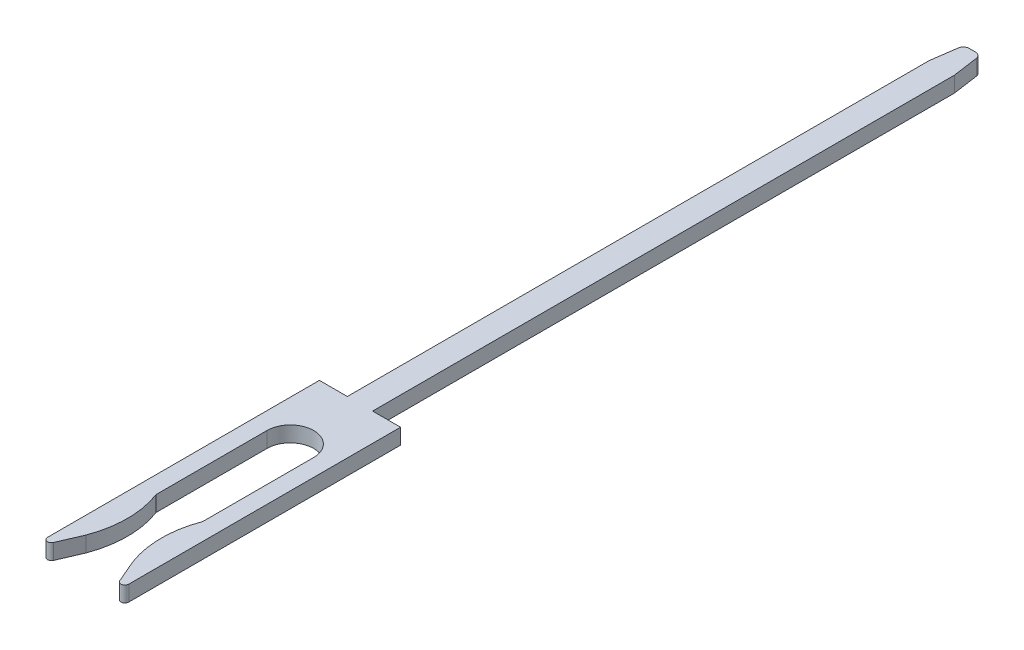
ISO-10303-21;
HEADER;
FILE_DESCRIPTION(('STEP AP214'),'2;1');
FILE_NAME('part.step','',(''),(''),'','','');
FILE_SCHEMA(('AUTOMOTIVE_DESIGN { 1 0 10303 214 1 1 1 1 }'));
ENDSEC;
DATA;
#1=APPLICATION_CONTEXT('core data for automotive mechanical design processes');
#2=APPLICATION_PROTOCOL_DEFINITION('international standard','automotive_design',2000,#1);
#3=PRODUCT_CONTEXT('',#1,'mechanical');
#4=PRODUCT('Part','Part','',(#3));
#5=PRODUCT_RELATED_PRODUCT_CATEGORY('part','',(#4));
#6=PRODUCT_DEFINITION_FORMATION('','',#4);
#7=PRODUCT_DEFINITION_CONTEXT('part definition',#1,'design');
#8=PRODUCT_DEFINITION('design','',#6,#7);
#9=PRODUCT_DEFINITION_SHAPE('','',#8);
#10=(LENGTH_UNIT() NAMED_UNIT(*) SI_UNIT(.MILLI.,.METRE.));
#11=(NAMED_UNIT(*) PLANE_ANGLE_UNIT() SI_UNIT($,.RADIAN.));
#12=(NAMED_UNIT(*) SI_UNIT($,.STERADIAN.) SOLID_ANGLE_UNIT());
#13=UNCERTAINTY_MEASURE_WITH_UNIT(LENGTH_MEASURE(1.E-05),#10,'distance_accuracy_value','');
#14=(GEOMETRIC_REPRESENTATION_CONTEXT(3) GLOBAL_UNCERTAINTY_ASSIGNED_CONTEXT((#13)) GLOBAL_UNIT_ASSIGNED_CONTEXT((#10,
#11,#12)) REPRESENTATION_CONTEXT('',''));
#15=CARTESIAN_POINT('',(0.,0.,0.));
#16=DIRECTION('',(0.,0.,1.));
#17=DIRECTION('',(1.,0.,0.));
#18=AXIS2_PLACEMENT_3D('',#15,#16,#17);
#19=CARTESIAN_POINT('',(0.,-0.2,-1.608293682814));
#20=DIRECTION('',(0.,1.,0.));
#21=DIRECTION('',(-1.,0.,0.));
#22=AXIS2_PLACEMENT_3D('',#19,#20,#21);
#23=PLANE('',#22);
#24=CARTESIAN_POINT('',(0.942803458142,-0.2,7.87327103256));
#25=DIRECTION('',(0.,1.,0.));
#26=DIRECTION('',(0.,0.,1.));
#27=AXIS2_PLACEMENT_3D('',#24,#25,#26);
#28=CIRCLE('',#27,0.1);
#29=CARTESIAN_POINT('',(0.850958820007882,-0.2,7.91282558281616));
#30=VERTEX_POINT('',#29);
#31=CARTESIAN_POINT('',(1.042803458142,-0.2,7.87327103256));
#32=VERTEX_POINT('',#31);
#33=EDGE_CURVE('E20',#30,#32,#28,.T.);
#34=ORIENTED_EDGE('',*,*,#33,.F.);
#35=DIRECTION('',(0.395545502563452,0.,0.918446381342877));
#36=VECTOR('',#35,1.);
#37=CARTESIAN_POINT('',(0.600313171744,-0.2,7.330832898901));
#38=LINE('',#37,#36);
#39=CARTESIAN_POINT('',(0.600313171747545,-0.2,7.33083289890927));
#40=VERTEX_POINT('',#39);
#41=EDGE_CURVE('E123',#40,#30,#38,.T.);
#42=ORIENTED_EDGE('',*,*,#41,.F.);
#43=CARTESIAN_POINT('',(2.982794916699,-0.2,6.429959744357));
#44=DIRECTION('',(0.,1.,0.));
#45=DIRECTION('',(0.,0.,1.));
#46=AXIS2_PLACEMENT_3D('',#43,#44,#45);
#47=CIRCLE('',#46,2.547114388012);
#48=CARTESIAN_POINT('',(0.60031317174438,-0.2,5.52908658981429));
#49=VERTEX_POINT('',#48);
#50=EDGE_CURVE('E145',#49,#40,#47,.T.);
#51=ORIENTED_EDGE('',*,*,#50,.F.);
#52=DIRECTION('',(0.,0.,1.));
#53=VECTOR('',#52,1.);
#54=CARTESIAN_POINT('',(0.600313171744,-0.2,4.103376530111));
#55=LINE('',#54,#53);
#56=CARTESIAN_POINT('',(0.600313171744,-0.2,2.677666470408));
#57=VERTEX_POINT('',#56);
#58=EDGE_CURVE('E152',#57,#49,#55,.T.);
#59=ORIENTED_EDGE('',*,*,#58,.F.);
#60=CARTESIAN_POINT('',(0.,-0.2,2.677666470408));
#61=DIRECTION('',(0.,1.,0.));
#62=DIRECTION('',(0.,0.,1.));
#63=AXIS2_PLACEMENT_3D('',#60,#61,#62);
#64=CIRCLE('',#63,0.600313171744);
#65=CARTESIAN_POINT('',(-0.600313171744,-0.2,2.677666470408));
#66=VERTEX_POINT('',#65);
#67=EDGE_CURVE('E158',#57,#66,#64,.T.);
#68=ORIENTED_EDGE('',*,*,#67,.T.);
#69=DIRECTION('',(0.,0.,-1.));
#70=VECTOR('',#69,1.);
#71=CARTESIAN_POINT('',(-0.600313171744,-0.2,4.103376530111));
#72=LINE('',#71,#70);
#73=CARTESIAN_POINT('',(-0.600313171744,-0.2,5.52908658981415));
#74=VERTEX_POINT('',#73);
#75=EDGE_CURVE('E162',#74,#66,#72,.T.);
#76=ORIENTED_EDGE('',*,*,#75,.F.);
#77=CARTESIAN_POINT('',(-2.982794916699,-0.2,6.429959744357));
#78=DIRECTION('',(0.,1.,0.));
#79=DIRECTION('',(0.,0.,1.));
#80=AXIS2_PLACEMENT_3D('',#77,#78,#79);
#81=CIRCLE('',#80,2.547114388012);
#82=CARTESIAN_POINT('',(-0.600313171748136,-0.2,7.33083289890964));
#83=VERTEX_POINT('',#82);
#84=EDGE_CURVE('E163',#83,#74,#81,.T.);
#85=ORIENTED_EDGE('',*,*,#84,.F.);
#86=DIRECTION('',(0.395545502563026,0.,-0.918446381343061));
#87=VECTOR('',#86,1.);
#88=CARTESIAN_POINT('',(-0.725635995876,-0.2,7.621829240859));
#89=LINE('',#88,#87);
#90=CARTESIAN_POINT('',(-0.850958820007715,-0.2,7.91282558281621));
#91=VERTEX_POINT('',#90);
#92=EDGE_CURVE('E167',#91,#83,#89,.T.);
#93=ORIENTED_EDGE('',*,*,#92,.F.);
#94=CARTESIAN_POINT('',(-0.942803458142,-0.2,7.87327103256));
#95=DIRECTION('',(0.,1.,0.));
#96=DIRECTION('',(0.,0.,1.));
#97=AXIS2_PLACEMENT_3D('',#94,#95,#96);
#98=CIRCLE('',#97,0.1);
#99=CARTESIAN_POINT('',(-1.042803458142,-0.2,7.87327103256));
#100=VERTEX_POINT('',#99);
#101=EDGE_CURVE('E171',#100,#91,#98,.T.);
#102=ORIENTED_EDGE('',*,*,#101,.F.);
#103=DIRECTION('',(0.,0.,1.));
#104=VECTOR('',#103,1.);
#105=CARTESIAN_POINT('',(-1.042803458142,-0.2,4.380777440661));
#106=LINE('',#105,#104);
#107=CARTESIAN_POINT('',(-1.042803458142,-0.2,0.888283848763));
#108=VERTEX_POINT('',#107);
#109=EDGE_CURVE('E175',#108,#100,#106,.T.);
#110=ORIENTED_EDGE('',*,*,#109,.F.);
#111=DIRECTION('',(-1.,0.,0.));
#112=VECTOR('',#111,1.);
#113=CARTESIAN_POINT('',(-0.68363654254,-0.2,0.888283848763));
#114=LINE('',#113,#112);
#115=CARTESIAN_POINT('',(-0.324469626938,-0.2,0.888283848763));
#116=VERTEX_POINT('',#115);
#117=EDGE_CURVE('E179',#116,#108,#114,.T.);
#118=ORIENTED_EDGE('',*,*,#117,.F.);
#119=DIRECTION('',(0.,0.,1.));
#120=VECTOR('',#119,1.);
#121=CARTESIAN_POINT('',(-0.324469626938,-0.2,-6.586787692129));
#122=LINE('',#121,#120);
#123=CARTESIAN_POINT('',(-0.324469626937927,-0.2,-14.06185923302));
#124=VERTEX_POINT('',#123);
#125=EDGE_CURVE('E192',#124,#116,#122,.T.);
#126=ORIENTED_EDGE('',*,*,#125,.F.);
#127=DIRECTION('',(-0.14003721977097,0.,0.990146240248791));
#128=VECTOR('',#127,1.);
#129=CARTESIAN_POINT('',(-0.277856708192,-0.2,-14.39144022812));
#130=LINE('',#129,#128);
#131=CARTESIAN_POINT('',(-0.231243789446517,-0.2,-14.7210212232179));
#132=VERTEX_POINT('',#131);
#133=EDGE_CURVE('E203',#132,#124,#130,.T.);
#134=ORIENTED_EDGE('',*,*,#133,.F.);
#135=CARTESIAN_POINT('',(-0.08272185340831,-0.2,-14.70001564025));
#136=DIRECTION('',(0.,1.,0.));
#137=DIRECTION('',(0.,0.,1.));
#138=AXIS2_PLACEMENT_3D('',#135,#136,#137);
#139=CIRCLE('',#138,0.15);
#140=CARTESIAN_POINT('',(-0.08272185340831,-0.2,-14.85001564025));
#141=VERTEX_POINT('',#140);
#142=EDGE_CURVE('E209',#141,#132,#139,.T.);
#143=ORIENTED_EDGE('',*,*,#142,.F.);
#144=DIRECTION('',(-1.,0.,0.));
#145=VECTOR('',#144,1.);
#146=CARTESIAN_POINT('',(0.,-0.2,-14.85001564025));
#147=LINE('',#146,#145);
#148=CARTESIAN_POINT('',(0.08272185340831,-0.2,-14.85001564025));
#149=VERTEX_POINT('',#148);
#150=EDGE_CURVE('E213',#149,#141,#147,.T.);
#151=ORIENTED_EDGE('',*,*,#150,.F.);
#152=CARTESIAN_POINT('',(0.08272185340831,-0.2,-14.70001564025));
#153=DIRECTION('',(0.,1.,0.));
#154=DIRECTION('',(0.,0.,1.));
#155=AXIS2_PLACEMENT_3D('',#152,#153,#154);
#156=CIRCLE('',#155,0.15);
#157=CARTESIAN_POINT('',(0.231243789445924,-0.2,-14.7210212232178));
#158=VERTEX_POINT('',#157);
#159=EDGE_CURVE('E217',#158,#149,#156,.T.);
#160=ORIENTED_EDGE('',*,*,#159,.F.);
#161=DIRECTION('',(-0.14003721977097,0.,-0.990146240248791));
#162=VECTOR('',#161,1.);
#163=CARTESIAN_POINT('',(0.277856708192,-0.2,-14.39144022812));
#164=LINE('',#163,#162);
#165=CARTESIAN_POINT('',(0.324469626937855,-0.2,-14.06185923302));
#166=VERTEX_POINT('',#165);
#167=EDGE_CURVE('E221',#166,#158,#164,.T.);
#168=ORIENTED_EDGE('',*,*,#167,.F.);
#169=DIRECTION('',(0.,0.,-1.));
#170=VECTOR('',#169,1.);
#171=CARTESIAN_POINT('',(0.324469626938,-0.2,-6.586787692129));
#172=LINE('',#171,#170);
#173=CARTESIAN_POINT('',(0.324469626938,-0.2,0.888283848763));
#174=VERTEX_POINT('',#173);
#175=EDGE_CURVE('E225',#174,#166,#172,.T.);
#176=ORIENTED_EDGE('',*,*,#175,.F.);
#177=DIRECTION('',(-1.,0.,0.));
#178=VECTOR('',#177,1.);
#179=CARTESIAN_POINT('',(0.68363654254,-0.2,0.888283848763));
#180=LINE('',#179,#178);
#181=CARTESIAN_POINT('',(1.042803458142,-0.2,0.888283848763));
#182=VERTEX_POINT('',#181);
#183=EDGE_CURVE('E238',#182,#174,#180,.T.);
#184=ORIENTED_EDGE('',*,*,#183,.F.);
#185=DIRECTION('',(0.,0.,-1.));
#186=VECTOR('',#185,1.);
#187=CARTESIAN_POINT('',(1.042803458142,-0.2,4.380777440661));
#188=LINE('',#187,#186);
#189=EDGE_CURVE('E135',#32,#182,#188,.T.);
#190=ORIENTED_EDGE('',*,*,#189,.F.);
#191=EDGE_LOOP('',(#34,#42,#51,#59,#68,#76,#85,#93,#102,#110,#118,#126,#134,#143,#151,#160,#168,
#176,#184,#190));
#192=FACE_BOUND('',#191,.T.);
#193=ADVANCED_FACE('F17',(#192),#23,.F.);
#194=CARTESIAN_POINT('',(0.942803458142,-0.2,7.87327103256));
#195=DIRECTION('',(0.,1.,0.));
#196=DIRECTION('',(0.,0.,1.));
#197=AXIS2_PLACEMENT_3D('',#194,#195,#196);
#198=CYLINDRICAL_SURFACE('',#197,0.1);
#199=ORIENTED_EDGE('',*,*,#33,.T.);
#200=DIRECTION('',(0.,1.,0.));
#201=VECTOR('',#200,1.);
#202=CARTESIAN_POINT('',(1.042803458142,-0.2,7.87327103256));
#203=LINE('',#202,#201);
#204=CARTESIAN_POINT('',(1.042803458142,0.2,7.87327103256));
#205=VERTEX_POINT('',#204);
#206=EDGE_CURVE('E138',#205,#32,#203,.F.);
#207=ORIENTED_EDGE('',*,*,#206,.F.);
#208=CARTESIAN_POINT('',(0.942803458142,0.2,7.87327103256));
#209=DIRECTION('',(0.,1.,0.));
#210=DIRECTION('',(0.,0.,1.));
#211=AXIS2_PLACEMENT_3D('',#208,#209,#210);
#212=CIRCLE('',#211,0.1);
#213=CARTESIAN_POINT('',(0.850958820007882,0.2,7.91282558281616));
#214=VERTEX_POINT('',#213);
#215=EDGE_CURVE('E141',#214,#205,#212,.T.);
#216=ORIENTED_EDGE('',*,*,#215,.F.);
#217=DIRECTION('',(0.,1.,0.));
#218=VECTOR('',#217,1.);
#219=CARTESIAN_POINT('',(0.850958820007684,-0.2,7.91282558281614));
#220=LINE('',#219,#218);
#221=EDGE_CURVE('E127',#30,#214,#220,.T.);
#222=ORIENTED_EDGE('',*,*,#221,.F.);
#223=EDGE_LOOP('',(#199,#207,#216,#222));
#224=FACE_BOUND('',#223,.T.);
#225=ADVANCED_FACE('F139',(#224),#198,.T.);
#226=CARTESIAN_POINT('',(1.042803458142,-0.2,4.380777440661));
#227=DIRECTION('',(1.,0.,0.));
#228=DIRECTION('',(0.,0.,-1.));
#229=AXIS2_PLACEMENT_3D('',#226,#227,#228);
#230=PLANE('',#229);
#231=ORIENTED_EDGE('',*,*,#189,.T.);
#232=DIRECTION('',(0.,1.,0.));
#233=VECTOR('',#232,1.);
#234=CARTESIAN_POINT('',(1.042803458142,-0.2,0.888283848763));
#235=LINE('',#234,#233);
#236=CARTESIAN_POINT('',(1.042803458142,0.2,0.888283848763));
#237=VERTEX_POINT('',#236);
#238=EDGE_CURVE('E245',#237,#182,#235,.F.);
#239=ORIENTED_EDGE('',*,*,#238,.F.);
#240=DIRECTION('',(0.,0.,1.));
#241=VECTOR('',#240,1.);
#242=CARTESIAN_POINT('',(1.042803458142,0.2,-1.608293682814));
#243=LINE('',#242,#241);
#244=EDGE_CURVE('E143',#205,#237,#243,.F.);
#245=ORIENTED_EDGE('',*,*,#244,.F.);
#246=ORIENTED_EDGE('',*,*,#206,.T.);
#247=EDGE_LOOP('',(#231,#239,#245,#246));
#248=FACE_BOUND('',#247,.T.);
#249=ADVANCED_FACE('F343',(#248),#230,.T.);
#250=CARTESIAN_POINT('',(0.68363654254,-0.2,0.888283848763));
#251=DIRECTION('',(0.,0.,-1.));
#252=DIRECTION('',(-1.,0.,0.));
#253=AXIS2_PLACEMENT_3D('',#250,#251,#252);
#254=PLANE('',#253);
#255=ORIENTED_EDGE('',*,*,#183,.T.);
#256=DIRECTION('',(0.,1.,0.));
#257=VECTOR('',#256,1.);
#258=CARTESIAN_POINT('',(0.324469626938,-0.2,0.888283848763));
#259=LINE('',#258,#257);
#260=CARTESIAN_POINT('',(0.324469626938,0.2,0.888283848763));
#261=VERTEX_POINT('',#260);
#262=EDGE_CURVE('E235',#261,#174,#259,.F.);
#263=ORIENTED_EDGE('',*,*,#262,.F.);
#264=DIRECTION('',(-1.,0.,0.));
#265=VECTOR('',#264,1.);
#266=CARTESIAN_POINT('',(0.,0.2,0.888283848763));
#267=LINE('',#266,#265);
#268=EDGE_CURVE('E232',#237,#261,#267,.T.);
#269=ORIENTED_EDGE('',*,*,#268,.F.);
#270=ORIENTED_EDGE('',*,*,#238,.T.);
#271=EDGE_LOOP('',(#255,#263,#269,#270));
#272=FACE_BOUND('',#271,.T.);
#273=ADVANCED_FACE('F347',(#272),#254,.T.);
#274=CARTESIAN_POINT('',(0.324469626938,-0.2,-6.586787692129));
#275=DIRECTION('',(1.,0.,0.));
#276=DIRECTION('',(0.,0.,-1.));
#277=AXIS2_PLACEMENT_3D('',#274,#275,#276);
#278=PLANE('',#277);
#279=ORIENTED_EDGE('',*,*,#175,.T.);
#280=DIRECTION('',(0.,1.,0.));
#281=VECTOR('',#280,1.);
#282=CARTESIAN_POINT('',(0.324469626937782,-0.2,-14.06185923302));
#283=LINE('',#282,#281);
#284=CARTESIAN_POINT('',(0.324469626937927,0.2,-14.06185923302));
#285=VERTEX_POINT('',#284);
#286=EDGE_CURVE('E222',#285,#166,#283,.F.);
#287=ORIENTED_EDGE('',*,*,#286,.F.);
#288=DIRECTION('',(0.,0.,1.));
#289=VECTOR('',#288,1.);
#290=CARTESIAN_POINT('',(0.324469626938,0.2,-1.608293682814));
#291=LINE('',#290,#289);
#292=EDGE_CURVE('E228',#261,#285,#291,.F.);
#293=ORIENTED_EDGE('',*,*,#292,.F.);
#294=ORIENTED_EDGE('',*,*,#262,.T.);
#295=EDGE_LOOP('',(#279,#287,#293,#294));
#296=FACE_BOUND('',#295,.T.);
#297=ADVANCED_FACE('F353',(#296),#278,.T.);
#298=CARTESIAN_POINT('',(0.277856708192,-0.2,-14.39144022812));
#299=DIRECTION('',(0.990146240248791,0.,-0.14003721977097));
#300=DIRECTION('',(-0.14003721977097,0.,-0.990146240248791));
#301=AXIS2_PLACEMENT_3D('',#298,#299,#300);
#302=PLANE('',#301);
#303=ORIENTED_EDGE('',*,*,#167,.T.);
#304=DIRECTION('',(0.,1.,0.));
#305=VECTOR('',#304,1.);
#306=CARTESIAN_POINT('',(0.231243789445032,-0.2,-14.7210212232199));
#307=LINE('',#306,#305);
#308=CARTESIAN_POINT('',(0.231243789445807,0.2,-14.7210212232179));
#309=VERTEX_POINT('',#308);
#310=EDGE_CURVE('E218',#309,#158,#307,.F.);
#311=ORIENTED_EDGE('',*,*,#310,.F.);
#312=DIRECTION('',(-0.140037219771627,0.,-0.990146240248698));
#313=VECTOR('',#312,1.);
#314=CARTESIAN_POINT('',(0.324469626938,0.2,-14.06185923302));
#315=LINE('',#314,#313);
#316=EDGE_CURVE('E231',#285,#309,#315,.T.);
#317=ORIENTED_EDGE('',*,*,#316,.F.);
#318=ORIENTED_EDGE('',*,*,#286,.T.);
#319=EDGE_LOOP('',(#303,#311,#317,#318));
#320=FACE_BOUND('',#319,.T.);
#321=ADVANCED_FACE('F355',(#320),#302,.T.);
#322=CARTESIAN_POINT('',(0.08272185340831,-0.2,-14.70001564025));
#323=DIRECTION('',(0.,1.,0.));
#324=DIRECTION('',(0.,0.,1.));
#325=AXIS2_PLACEMENT_3D('',#322,#323,#324);
#326=CYLINDRICAL_SURFACE('',#325,0.15);
#327=ORIENTED_EDGE('',*,*,#159,.T.);
#328=DIRECTION('',(0.,1.,0.));
#329=VECTOR('',#328,1.);
#330=CARTESIAN_POINT('',(0.08272185340831,-0.2,-14.85001564025));
#331=LINE('',#330,#329);
#332=CARTESIAN_POINT('',(0.08272185340831,0.2,-14.85001564025));
#333=VERTEX_POINT('',#332);
#334=EDGE_CURVE('E214',#333,#149,#331,.F.);
#335=ORIENTED_EDGE('',*,*,#334,.F.);
#336=CARTESIAN_POINT('',(0.08272185340831,0.2,-14.70001564025));
#337=DIRECTION('',(0.,1.,0.));
#338=DIRECTION('',(0.,0.,1.));
#339=AXIS2_PLACEMENT_3D('',#336,#337,#338);
#340=CIRCLE('',#339,0.15);
#341=EDGE_CURVE('E303',#309,#333,#340,.T.);
#342=ORIENTED_EDGE('',*,*,#341,.F.);
#343=ORIENTED_EDGE('',*,*,#310,.T.);
#344=EDGE_LOOP('',(#327,#335,#342,#343));
#345=FACE_BOUND('',#344,.T.);
#346=ADVANCED_FACE('F313',(#345),#326,.T.);
#347=CARTESIAN_POINT('',(0.,-0.2,-14.85001564025));
#348=DIRECTION('',(0.,0.,-1.));
#349=DIRECTION('',(-1.,0.,0.));
#350=AXIS2_PLACEMENT_3D('',#347,#348,#349);
#351=PLANE('',#350);
#352=ORIENTED_EDGE('',*,*,#150,.T.);
#353=DIRECTION('',(0.,1.,0.));
#354=VECTOR('',#353,1.);
#355=CARTESIAN_POINT('',(-0.08272185340831,-0.2,-14.85001564025));
#356=LINE('',#355,#354);
#357=CARTESIAN_POINT('',(-0.08272185340831,0.2,-14.85001564025));
#358=VERTEX_POINT('',#357);
#359=EDGE_CURVE('E210',#358,#141,#356,.F.);
#360=ORIENTED_EDGE('',*,*,#359,.F.);
#361=DIRECTION('',(-1.,0.,0.));
#362=VECTOR('',#361,1.);
#363=CARTESIAN_POINT('',(0.,0.2,-14.85001564025));
#364=LINE('',#363,#362);
#365=EDGE_CURVE('E302',#333,#358,#364,.T.);
#366=ORIENTED_EDGE('',*,*,#365,.F.);
#367=ORIENTED_EDGE('',*,*,#334,.T.);
#368=EDGE_LOOP('',(#352,#360,#366,#367));
#369=FACE_BOUND('',#368,.T.);
#370=ADVANCED_FACE('F320',(#369),#351,.T.);
#371=CARTESIAN_POINT('',(-0.08272185340831,-0.2,-14.70001564025));
#372=DIRECTION('',(0.,1.,0.));
#373=DIRECTION('',(0.,0.,1.));
#374=AXIS2_PLACEMENT_3D('',#371,#372,#373);
#375=CYLINDRICAL_SURFACE('',#374,0.15);
#376=ORIENTED_EDGE('',*,*,#142,.T.);
#377=DIRECTION('',(0.,1.,0.));
#378=VECTOR('',#377,1.);
#379=CARTESIAN_POINT('',(-0.231243789446218,-0.2,-14.72102122322));
#380=LINE('',#379,#378);
#381=CARTESIAN_POINT('',(-0.2312437894464,0.2,-14.721021223218));
#382=VERTEX_POINT('',#381);
#383=EDGE_CURVE('E206',#382,#132,#380,.F.);
#384=ORIENTED_EDGE('',*,*,#383,.F.);
#385=CARTESIAN_POINT('',(-0.08272185340831,0.2,-14.70001564025));
#386=DIRECTION('',(0.,1.,0.));
#387=DIRECTION('',(0.,0.,1.));
#388=AXIS2_PLACEMENT_3D('',#385,#386,#387);
#389=CIRCLE('',#388,0.15);
#390=EDGE_CURVE('E299',#358,#382,#389,.T.);
#391=ORIENTED_EDGE('',*,*,#390,.F.);
#392=ORIENTED_EDGE('',*,*,#359,.T.);
#393=EDGE_LOOP('',(#376,#384,#391,#392));
#394=FACE_BOUND('',#393,.T.);
#395=ADVANCED_FACE('F523',(#394),#375,.T.);
#396=CARTESIAN_POINT('',(-0.277856708192,-0.2,-14.39144022812));
#397=DIRECTION('',(-0.990146240248791,0.,-0.14003721977097));
#398=DIRECTION('',(-0.14003721977097,0.,0.990146240248791));
#399=AXIS2_PLACEMENT_3D('',#396,#397,#398);
#400=PLANE('',#399);
#401=ORIENTED_EDGE('',*,*,#133,.T.);
#402=DIRECTION('',(0.,1.,0.));
#403=VECTOR('',#402,1.);
#404=CARTESIAN_POINT('',(-0.324469626938,-0.2,-14.06185923302));
#405=LINE('',#404,#403);
#406=CARTESIAN_POINT('',(-0.324469626938,0.2,-14.06185923302));
#407=VERTEX_POINT('',#406);
#408=EDGE_CURVE('E200',#407,#124,#405,.F.);
#409=ORIENTED_EDGE('',*,*,#408,.F.);
#410=DIRECTION('',(-0.140037219771627,0.,0.990146240248698));
#411=VECTOR('',#410,1.);
#412=CARTESIAN_POINT('',(-0.231243789446,0.2,-14.72102122322));
#413=LINE('',#412,#411);
#414=EDGE_CURVE('E197',#382,#407,#413,.T.);
#415=ORIENTED_EDGE('',*,*,#414,.F.);
#416=ORIENTED_EDGE('',*,*,#383,.T.);
#417=EDGE_LOOP('',(#401,#409,#415,#416));
#418=FACE_BOUND('',#417,.T.);
#419=ADVANCED_FACE('F514',(#418),#400,.T.);
#420=CARTESIAN_POINT('',(-0.324469626938,-0.2,-6.586787692129));
#421=DIRECTION('',(-1.,0.,0.));
#422=DIRECTION('',(0.,0.,1.));
#423=AXIS2_PLACEMENT_3D('',#420,#421,#422);
#424=PLANE('',#423);
#425=ORIENTED_EDGE('',*,*,#125,.T.);
#426=DIRECTION('',(0.,1.,0.));
#427=VECTOR('',#426,1.);
#428=CARTESIAN_POINT('',(-0.324469626938,-0.2,0.888283848763));
#429=LINE('',#428,#427);
#430=CARTESIAN_POINT('',(-0.324469626938,0.2,0.888283848763));
#431=VERTEX_POINT('',#430);
#432=EDGE_CURVE('E189',#431,#116,#429,.F.);
#433=ORIENTED_EDGE('',*,*,#432,.F.);
#434=DIRECTION('',(0.,0.,1.));
#435=VECTOR('',#434,1.);
#436=CARTESIAN_POINT('',(-0.324469626938,0.2,-1.608293682814));
#437=LINE('',#436,#435);
#438=EDGE_CURVE('E186',#407,#431,#437,.T.);
#439=ORIENTED_EDGE('',*,*,#438,.F.);
#440=ORIENTED_EDGE('',*,*,#408,.T.);
#441=EDGE_LOOP('',(#425,#433,#439,#440));
#442=FACE_BOUND('',#441,.T.);
#443=ADVANCED_FACE('F384',(#442),#424,.T.);
#444=CARTESIAN_POINT('',(-0.68363654254,-0.2,0.888283848763));
#445=DIRECTION('',(0.,0.,-1.));
#446=DIRECTION('',(-1.,0.,0.));
#447=AXIS2_PLACEMENT_3D('',#444,#445,#446);
#448=PLANE('',#447);
#449=ORIENTED_EDGE('',*,*,#117,.T.);
#450=DIRECTION('',(0.,1.,0.));
#451=VECTOR('',#450,1.);
#452=CARTESIAN_POINT('',(-1.042803458142,-0.2,0.888283848763));
#453=LINE('',#452,#451);
#454=CARTESIAN_POINT('',(-1.042803458142,0.2,0.888283848763));
#455=VERTEX_POINT('',#454);
#456=EDGE_CURVE('E176',#455,#108,#453,.F.);
#457=ORIENTED_EDGE('',*,*,#456,.F.);
#458=DIRECTION('',(-1.,0.,0.));
#459=VECTOR('',#458,1.);
#460=CARTESIAN_POINT('',(0.,0.2,0.888283848763));
#461=LINE('',#460,#459);
#462=EDGE_CURVE('E182',#431,#455,#461,.T.);
#463=ORIENTED_EDGE('',*,*,#462,.F.);
#464=ORIENTED_EDGE('',*,*,#432,.T.);
#465=EDGE_LOOP('',(#449,#457,#463,#464));
#466=FACE_BOUND('',#465,.T.);
#467=ADVANCED_FACE('F372',(#466),#448,.T.);
#468=CARTESIAN_POINT('',(-1.042803458142,-0.2,4.380777440661));
#469=DIRECTION('',(-1.,0.,0.));
#470=DIRECTION('',(0.,0.,1.));
#471=AXIS2_PLACEMENT_3D('',#468,#469,#470);
#472=PLANE('',#471);
#473=ORIENTED_EDGE('',*,*,#109,.T.);
#474=DIRECTION('',(0.,1.,0.));
#475=VECTOR('',#474,1.);
#476=CARTESIAN_POINT('',(-1.042803458142,-0.2,7.87327103256));
#477=LINE('',#476,#475);
#478=CARTESIAN_POINT('',(-1.042803458142,0.2,7.87327103256));
#479=VERTEX_POINT('',#478);
#480=EDGE_CURVE('E172',#479,#100,#477,.F.);
#481=ORIENTED_EDGE('',*,*,#480,.F.);
#482=DIRECTION('',(0.,0.,1.));
#483=VECTOR('',#482,1.);
#484=CARTESIAN_POINT('',(-1.042803458142,0.2,-1.608293682814));
#485=LINE('',#484,#483);
#486=EDGE_CURVE('E185',#455,#479,#485,.T.);
#487=ORIENTED_EDGE('',*,*,#486,.F.);
#488=ORIENTED_EDGE('',*,*,#456,.T.);
#489=EDGE_LOOP('',(#473,#481,#487,#488));
#490=FACE_BOUND('',#489,.T.);
#491=ADVANCED_FACE('F377',(#490),#472,.T.);
#492=CARTESIAN_POINT('',(-0.942803458142,-0.2,7.87327103256));
#493=DIRECTION('',(0.,1.,0.));
#494=DIRECTION('',(0.,0.,1.));
#495=AXIS2_PLACEMENT_3D('',#492,#493,#494);
#496=CYLINDRICAL_SURFACE('',#495,0.1);
#497=ORIENTED_EDGE('',*,*,#101,.T.);
#498=DIRECTION('',(0.,1.,0.));
#499=VECTOR('',#498,1.);
#500=CARTESIAN_POINT('',(-0.850958820007684,-0.2,7.91282558281614));
#501=LINE('',#500,#499);
#502=CARTESIAN_POINT('',(-0.850958820007882,0.2,7.91282558281616));
#503=VERTEX_POINT('',#502);
#504=EDGE_CURVE('E168',#503,#91,#501,.F.);
#505=ORIENTED_EDGE('',*,*,#504,.F.);
#506=CARTESIAN_POINT('',(-0.942803458142,0.2,7.87327103256));
#507=DIRECTION('',(0.,1.,0.));
#508=DIRECTION('',(0.,0.,1.));
#509=AXIS2_PLACEMENT_3D('',#506,#507,#508);
#510=CIRCLE('',#509,0.1);
#511=EDGE_CURVE('E296',#479,#503,#510,.T.);
#512=ORIENTED_EDGE('',*,*,#511,.F.);
#513=ORIENTED_EDGE('',*,*,#480,.T.);
#514=EDGE_LOOP('',(#497,#505,#512,#513));
#515=FACE_BOUND('',#514,.T.);
#516=ADVANCED_FACE('F390',(#515),#496,.T.);
#517=CARTESIAN_POINT('',(-0.725635995876,-0.2,7.621829240859));
#518=DIRECTION('',(0.918446381343061,0.,0.395545502563026));
#519=DIRECTION('',(0.395545502563026,0.,-0.918446381343061));
#520=AXIS2_PLACEMENT_3D('',#517,#518,#519);
#521=PLANE('',#520);
#522=ORIENTED_EDGE('',*,*,#92,.T.);
#523=DIRECTION('',(0.,1.,0.));
#524=VECTOR('',#523,1.);
#525=CARTESIAN_POINT('',(-0.600313171744759,-0.2,7.33083289890071));
#526=LINE('',#525,#524);
#527=CARTESIAN_POINT('',(-0.600313171747937,0.2,7.33083289890912));
#528=VERTEX_POINT('',#527);
#529=EDGE_CURVE('E164',#528,#83,#526,.F.);
#530=ORIENTED_EDGE('',*,*,#529,.F.);
#531=DIRECTION('',(0.395545502563452,0.,-0.918446381342877));
#532=VECTOR('',#531,1.);
#533=CARTESIAN_POINT('',(-0.850958820008,0.2,7.912825582816));
#534=LINE('',#533,#532);
#535=EDGE_CURVE('E295',#503,#528,#534,.T.);
#536=ORIENTED_EDGE('',*,*,#535,.F.);
#537=ORIENTED_EDGE('',*,*,#504,.T.);
#538=EDGE_LOOP('',(#522,#530,#536,#537));
#539=FACE_BOUND('',#538,.T.);
#540=ADVANCED_FACE('F472',(#539),#521,.T.);
#541=CARTESIAN_POINT('',(-2.982794916699,-0.2,6.429959744357));
#542=DIRECTION('',(0.,1.,0.));
#543=DIRECTION('',(0.,0.,1.));
#544=AXIS2_PLACEMENT_3D('',#541,#542,#543);
#545=CYLINDRICAL_SURFACE('',#544,2.547114388012);
#546=ORIENTED_EDGE('',*,*,#84,.T.);
#547=DIRECTION('',(0.,1.,0.));
#548=VECTOR('',#547,1.);
#549=CARTESIAN_POINT('',(-0.600313171744,-0.2,5.529086589813));
#550=LINE('',#549,#548);
#551=CARTESIAN_POINT('',(-0.600313171744,0.2,5.52908658981415));
#552=VERTEX_POINT('',#551);
#553=EDGE_CURVE('E159',#552,#74,#550,.F.);
#554=ORIENTED_EDGE('',*,*,#553,.F.);
#555=CARTESIAN_POINT('',(-2.982794916699,0.2,6.429959744357));
#556=DIRECTION('',(0.,1.,0.));
#557=DIRECTION('',(0.,0.,1.));
#558=AXIS2_PLACEMENT_3D('',#555,#556,#557);
#559=CIRCLE('',#558,2.547114388012);
#560=EDGE_CURVE('E292',#528,#552,#559,.T.);
#561=ORIENTED_EDGE('',*,*,#560,.F.);
#562=ORIENTED_EDGE('',*,*,#529,.T.);
#563=EDGE_LOOP('',(#546,#554,#561,#562));
#564=FACE_BOUND('',#563,.T.);
#565=ADVANCED_FACE('F462',(#564),#545,.T.);
#566=CARTESIAN_POINT('',(-0.600313171744,-0.2,4.103376530111));
#567=DIRECTION('',(1.,0.,0.));
#568=DIRECTION('',(0.,0.,-1.));
#569=AXIS2_PLACEMENT_3D('',#566,#567,#568);
#570=PLANE('',#569);
#571=ORIENTED_EDGE('',*,*,#75,.T.);
#572=DIRECTION('',(0.,1.,0.));
#573=VECTOR('',#572,1.);
#574=CARTESIAN_POINT('',(-0.600313171744,-0.2,2.677666470408));
#575=LINE('',#574,#573);
#576=CARTESIAN_POINT('',(-0.600313171744,0.2,2.677666470408));
#577=VERTEX_POINT('',#576);
#578=EDGE_CURVE('E156',#66,#577,#575,.T.);
#579=ORIENTED_EDGE('',*,*,#578,.T.);
#580=DIRECTION('',(0.,0.,1.));
#581=VECTOR('',#580,1.);
#582=CARTESIAN_POINT('',(-0.600313171744,0.2,-1.608293682814));
#583=LINE('',#582,#581);
#584=EDGE_CURVE('E291',#552,#577,#583,.F.);
#585=ORIENTED_EDGE('',*,*,#584,.F.);
#586=ORIENTED_EDGE('',*,*,#553,.T.);
#587=EDGE_LOOP('',(#571,#579,#585,#586));
#588=FACE_BOUND('',#587,.T.);
#589=ADVANCED_FACE('F452',(#588),#570,.T.);
#590=CARTESIAN_POINT('',(0.,-0.2,2.677666470408));
#591=DIRECTION('',(0.,1.,0.));
#592=DIRECTION('',(0.,0.,1.));
#593=AXIS2_PLACEMENT_3D('',#590,#591,#592);
#594=CYLINDRICAL_SURFACE('',#593,0.600313171744);
#595=ORIENTED_EDGE('',*,*,#578,.F.);
#596=ORIENTED_EDGE('',*,*,#67,.F.);
#597=DIRECTION('',(0.,1.,0.));
#598=VECTOR('',#597,1.);
#599=CARTESIAN_POINT('',(0.600313171744,-0.2,2.677666470408));
#600=LINE('',#599,#598);
#601=CARTESIAN_POINT('',(0.600313171744,0.2,2.677666470408));
#602=VERTEX_POINT('',#601);
#603=EDGE_CURVE('E153',#602,#57,#600,.F.);
#604=ORIENTED_EDGE('',*,*,#603,.F.);
#605=CARTESIAN_POINT('',(0.,0.2,2.677666470408));
#606=DIRECTION('',(0.,1.,0.));
#607=DIRECTION('',(0.,0.,1.));
#608=AXIS2_PLACEMENT_3D('',#605,#606,#607);
#609=CIRCLE('',#608,0.600313171744);
#610=EDGE_CURVE('E288',#577,#602,#609,.F.);
#611=ORIENTED_EDGE('',*,*,#610,.F.);
#612=EDGE_LOOP('',(#595,#596,#604,#611));
#613=FACE_BOUND('',#612,.T.);
#614=ADVANCED_FACE('F418',(#613),#594,.F.);
#615=CARTESIAN_POINT('',(0.600313171744,-0.2,4.103376530111));
#616=DIRECTION('',(-1.,0.,0.));
#617=DIRECTION('',(0.,0.,1.));
#618=AXIS2_PLACEMENT_3D('',#615,#616,#617);
#619=PLANE('',#618);
#620=ORIENTED_EDGE('',*,*,#58,.T.);
#621=DIRECTION('',(0.,1.,0.));
#622=VECTOR('',#621,1.);
#623=CARTESIAN_POINT('',(0.600313171744759,-0.2,5.52908658981329));
#624=LINE('',#623,#622);
#625=CARTESIAN_POINT('',(0.60031317174438,0.2,5.52908658981429));
#626=VERTEX_POINT('',#625);
#627=EDGE_CURVE('E149',#626,#49,#624,.F.);
#628=ORIENTED_EDGE('',*,*,#627,.F.);
#629=DIRECTION('',(0.,0.,1.));
#630=VECTOR('',#629,1.);
#631=CARTESIAN_POINT('',(0.600313171744,0.2,-1.608293682814));
#632=LINE('',#631,#630);
#633=EDGE_CURVE('E287',#602,#626,#632,.T.);
#634=ORIENTED_EDGE('',*,*,#633,.F.);
#635=ORIENTED_EDGE('',*,*,#603,.T.);
#636=EDGE_LOOP('',(#620,#628,#634,#635));
#637=FACE_BOUND('',#636,.T.);
#638=ADVANCED_FACE('F407',(#637),#619,.T.);
#639=CARTESIAN_POINT('',(2.982794916699,-0.2,6.429959744357));
#640=DIRECTION('',(0.,1.,0.));
#641=DIRECTION('',(0.,0.,1.));
#642=AXIS2_PLACEMENT_3D('',#639,#640,#641);
#643=CYLINDRICAL_SURFACE('',#642,2.547114388012);
#644=ORIENTED_EDGE('',*,*,#50,.T.);
#645=DIRECTION('',(0.,1.,0.));
#646=VECTOR('',#645,1.);
#647=CARTESIAN_POINT('',(0.600313171743953,-0.2,7.33083289890102));
#648=LINE('',#647,#646);
#649=CARTESIAN_POINT('',(0.600313171747545,0.2,7.33083289890927));
#650=VERTEX_POINT('',#649);
#651=EDGE_CURVE('E35',#650,#40,#648,.F.);
#652=ORIENTED_EDGE('',*,*,#651,.F.);
#653=CARTESIAN_POINT('',(2.982794916699,0.2,6.429959744357));
#654=DIRECTION('',(0.,1.,0.));
#655=DIRECTION('',(0.,0.,1.));
#656=AXIS2_PLACEMENT_3D('',#653,#654,#655);
#657=CIRCLE('',#656,2.547114388012);
#658=EDGE_CURVE('E26',#626,#650,#657,.T.);
#659=ORIENTED_EDGE('',*,*,#658,.F.);
#660=ORIENTED_EDGE('',*,*,#627,.T.);
#661=EDGE_LOOP('',(#644,#652,#659,#660));
#662=FACE_BOUND('',#661,.T.);
#663=ADVANCED_FACE('F409',(#662),#643,.T.);
#664=CARTESIAN_POINT('',(0.725635995876,-0.2,7.621829240859));
#665=DIRECTION('',(-0.918446381343061,0.,0.395545502563026));
#666=DIRECTION('',(0.395545502563026,0.,0.918446381343061));
#667=AXIS2_PLACEMENT_3D('',#664,#665,#666);
#668=PLANE('',#667);
#669=ORIENTED_EDGE('',*,*,#41,.T.);
#670=ORIENTED_EDGE('',*,*,#221,.T.);
#671=DIRECTION('',(0.395545502563452,0.,0.918446381342877));
#672=VECTOR('',#671,1.);
#673=CARTESIAN_POINT('',(0.600313171744,0.2,7.330832898901));
#674=LINE('',#673,#672);
#675=EDGE_CURVE('E11',#650,#214,#674,.T.);
#676=ORIENTED_EDGE('',*,*,#675,.F.);
#677=ORIENTED_EDGE('',*,*,#651,.T.);
#678=EDGE_LOOP('',(#669,#670,#676,#677));
#679=FACE_BOUND('',#678,.T.);
#680=ADVANCED_FACE('F125',(#679),#668,.T.);
#681=CARTESIAN_POINT('',(0.,0.2,-1.608293682814));
#682=DIRECTION('',(0.,1.,0.));
#683=DIRECTION('',(-1.,0.,0.));
#684=AXIS2_PLACEMENT_3D('',#681,#682,#683);
#685=PLANE('',#684);
#686=ORIENTED_EDGE('',*,*,#658,.T.);
#687=ORIENTED_EDGE('',*,*,#675,.T.);
#688=ORIENTED_EDGE('',*,*,#215,.T.);
#689=ORIENTED_EDGE('',*,*,#244,.T.);
#690=ORIENTED_EDGE('',*,*,#268,.T.);
#691=ORIENTED_EDGE('',*,*,#292,.T.);
#692=ORIENTED_EDGE('',*,*,#316,.T.);
#693=ORIENTED_EDGE('',*,*,#341,.T.);
#694=ORIENTED_EDGE('',*,*,#365,.T.);
#695=ORIENTED_EDGE('',*,*,#390,.T.);
#696=ORIENTED_EDGE('',*,*,#414,.T.);
#697=ORIENTED_EDGE('',*,*,#438,.T.);
#698=ORIENTED_EDGE('',*,*,#462,.T.);
#699=ORIENTED_EDGE('',*,*,#486,.T.);
#700=ORIENTED_EDGE('',*,*,#511,.T.);
#701=ORIENTED_EDGE('',*,*,#535,.T.);
#702=ORIENTED_EDGE('',*,*,#560,.T.);
#703=ORIENTED_EDGE('',*,*,#584,.T.);
#704=ORIENTED_EDGE('',*,*,#610,.T.);
#705=ORIENTED_EDGE('',*,*,#633,.T.);
#706=EDGE_LOOP('',(#686,#687,#688,#689,#690,#691,#692,#693,#694,#695,#696,#697,#698,#699,#700,
#701,#702,#703,#704,#705));
#707=FACE_BOUND('',#706,.T.);
#708=ADVANCED_FACE('F326',(#707),#685,.T.);
#709=CLOSED_SHELL('',(#193,#225,#249,#273,#297,#321,#346,#370,#395,#419,#443,#467,#491,#516,
#540,#565,#589,#614,#638,#663,#680,#708));
#710=MANIFOLD_SOLID_BREP('B1',#709);
#711=ADVANCED_BREP_SHAPE_REPRESENTATION('',(#18,#710),#14);
#712=SHAPE_DEFINITION_REPRESENTATION(#9,#711);
ENDSEC;
END-ISO-10303-21;
